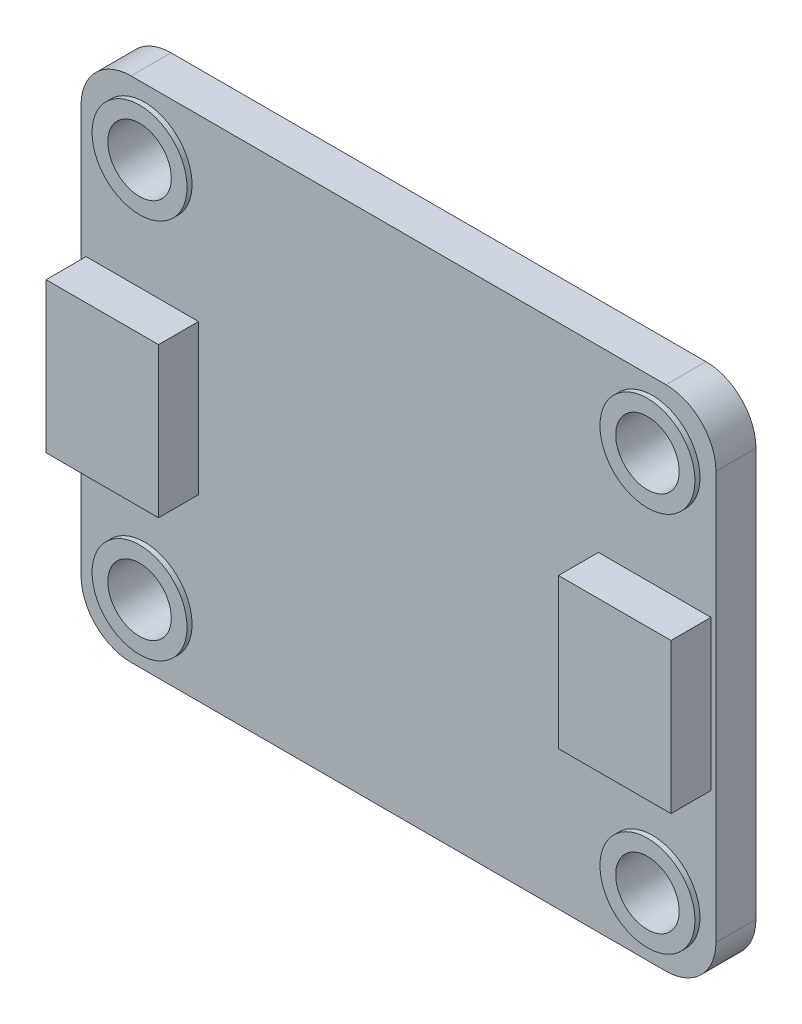
ISO-10303-21;
HEADER;
FILE_DESCRIPTION(('STEP AP214'),'2;1');
FILE_NAME('part.step','',(''),(''),'','','');
FILE_SCHEMA(('AUTOMOTIVE_DESIGN { 1 0 10303 214 1 1 1 1 }'));
ENDSEC;
DATA;
#1=APPLICATION_CONTEXT('core data for automotive mechanical design processes');
#2=APPLICATION_PROTOCOL_DEFINITION('international standard','automotive_design',2000,#1);
#3=PRODUCT_CONTEXT('',#1,'mechanical');
#4=PRODUCT('Part','Part','',(#3));
#5=PRODUCT_RELATED_PRODUCT_CATEGORY('part','',(#4));
#6=PRODUCT_DEFINITION_FORMATION('','',#4);
#7=PRODUCT_DEFINITION_CONTEXT('part definition',#1,'design');
#8=PRODUCT_DEFINITION('design','',#6,#7);
#9=PRODUCT_DEFINITION_SHAPE('','',#8);
#10=(LENGTH_UNIT() NAMED_UNIT(*) SI_UNIT(.MILLI.,.METRE.));
#11=(NAMED_UNIT(*) PLANE_ANGLE_UNIT() SI_UNIT($,.RADIAN.));
#12=(NAMED_UNIT(*) SI_UNIT($,.STERADIAN.) SOLID_ANGLE_UNIT());
#13=UNCERTAINTY_MEASURE_WITH_UNIT(LENGTH_MEASURE(1.E-05),#10,'distance_accuracy_value','');
#14=(GEOMETRIC_REPRESENTATION_CONTEXT(3) GLOBAL_UNCERTAINTY_ASSIGNED_CONTEXT((#13)) GLOBAL_UNIT_ASSIGNED_CONTEXT((#10,
#11,#12)) REPRESENTATION_CONTEXT('',''));
#15=CARTESIAN_POINT('',(0.,0.,0.));
#16=DIRECTION('',(0.,0.,1.));
#17=DIRECTION('',(1.,0.,0.));
#18=AXIS2_PLACEMENT_3D('',#15,#16,#17);
#19=CARTESIAN_POINT('',(0.,0.,1.6));
#20=DIRECTION('',(0.,0.,-1.));
#21=DIRECTION('',(-1.,0.,0.));
#22=AXIS2_PLACEMENT_3D('',#19,#20,#21);
#23=PLANE('',#22);
#24=DIRECTION('',(0.,-1.,0.));
#25=VECTOR('',#24,1.);
#26=CARTESIAN_POINT('',(0.200000000000002,0.,1.6));
#27=LINE('',#26,#25);
#28=CARTESIAN_POINT('',(0.2,13.16,1.6));
#29=VERTEX_POINT('',#28);
#30=CARTESIAN_POINT('',(0.200000000000001,7.16,1.6));
#31=VERTEX_POINT('',#30);
#32=EDGE_CURVE('E162',#29,#31,#27,.T.);
#33=ORIENTED_EDGE('',*,*,#32,.F.);
#34=DIRECTION('',(-1.,0.,0.));
#35=VECTOR('',#34,1.);
#36=CARTESIAN_POINT('',(0.,13.16,1.6));
#37=LINE('',#36,#35);
#38=CARTESIAN_POINT('',(4.7,13.16,1.6));
#39=VERTEX_POINT('',#38);
#40=EDGE_CURVE('E205',#39,#29,#37,.T.);
#41=ORIENTED_EDGE('',*,*,#40,.F.);
#42=DIRECTION('',(0.,1.,0.));
#43=VECTOR('',#42,1.);
#44=CARTESIAN_POINT('',(4.7,0.,1.6));
#45=LINE('',#44,#43);
#46=CARTESIAN_POINT('',(4.7,7.16,1.6));
#47=VERTEX_POINT('',#46);
#48=EDGE_CURVE('E222',#47,#39,#45,.T.);
#49=ORIENTED_EDGE('',*,*,#48,.F.);
#50=DIRECTION('',(1.,0.,0.));
#51=VECTOR('',#50,1.);
#52=CARTESIAN_POINT('',(0.,7.16,1.6));
#53=LINE('',#52,#51);
#54=EDGE_CURVE('E218',#31,#47,#53,.T.);
#55=ORIENTED_EDGE('',*,*,#54,.F.);
#56=EDGE_LOOP('',(#33,#41,#49,#55));
#57=FACE_BOUND('',#56,.T.);
#58=CARTESIAN_POINT('',(22.86,2.54,1.6));
#59=DIRECTION('',(0.,0.,-1.));
#60=DIRECTION('',(-1.,0.,0.));
#61=AXIS2_PLACEMENT_3D('',#58,#59,#60);
#62=CIRCLE('',#61,1.9);
#63=CARTESIAN_POINT('',(20.96,2.54,1.6));
#64=VERTEX_POINT('',#63);
#65=EDGE_CURVE('E53',#64,#64,#62,.F.);
#66=ORIENTED_EDGE('',*,*,#65,.F.);
#67=EDGE_LOOP('',(#66));
#68=FACE_BOUND('',#67,.T.);
#69=CARTESIAN_POINT('',(2.54,17.78,1.6));
#70=DIRECTION('',(0.,0.,-1.));
#71=DIRECTION('',(-1.,0.,0.));
#72=AXIS2_PLACEMENT_3D('',#69,#70,#71);
#73=CIRCLE('',#72,1.9);
#74=CARTESIAN_POINT('',(0.639999999999999,17.78,1.6));
#75=VERTEX_POINT('',#74);
#76=EDGE_CURVE('E301',#75,#75,#73,.F.);
#77=ORIENTED_EDGE('',*,*,#76,.F.);
#78=EDGE_LOOP('',(#77));
#79=FACE_BOUND('',#78,.T.);
#80=DIRECTION('',(-1.,0.,0.));
#81=VECTOR('',#80,1.);
#82=CARTESIAN_POINT('',(0.,20.32,1.6));
#83=LINE('',#82,#81);
#84=CARTESIAN_POINT('',(23.4,20.32,1.6));
#85=VERTEX_POINT('',#84);
#86=CARTESIAN_POINT('',(1.99999999999999,20.32,1.6));
#87=VERTEX_POINT('',#86);
#88=EDGE_CURVE('E336',#85,#87,#83,.T.);
#89=ORIENTED_EDGE('',*,*,#88,.T.);
#90=CARTESIAN_POINT('',(1.99999999999999,18.32,1.6));
#91=DIRECTION('',(0.,0.,-1.));
#92=DIRECTION('',(-1.,0.,0.));
#93=AXIS2_PLACEMENT_3D('',#90,#91,#92);
#94=CIRCLE('',#93,2.);
#95=CARTESIAN_POINT('',(0.,18.32,1.6));
#96=VERTEX_POINT('',#95);
#97=EDGE_CURVE('E390',#87,#96,#94,.F.);
#98=ORIENTED_EDGE('',*,*,#97,.T.);
#99=DIRECTION('',(0.,-1.,0.));
#100=VECTOR('',#99,1.);
#101=CARTESIAN_POINT('',(0.,0.,1.6));
#102=LINE('',#101,#100);
#103=CARTESIAN_POINT('',(0.,2.,1.6));
#104=VERTEX_POINT('',#103);
#105=EDGE_CURVE('E323',#96,#104,#102,.T.);
#106=ORIENTED_EDGE('',*,*,#105,.T.);
#107=CARTESIAN_POINT('',(2.,2.,1.6));
#108=DIRECTION('',(0.,0.,-1.));
#109=DIRECTION('',(-1.,0.,0.));
#110=AXIS2_PLACEMENT_3D('',#107,#108,#109);
#111=CIRCLE('',#110,2.);
#112=CARTESIAN_POINT('',(2.,0.,1.6));
#113=VERTEX_POINT('',#112);
#114=EDGE_CURVE('E387',#104,#113,#111,.F.);
#115=ORIENTED_EDGE('',*,*,#114,.T.);
#116=DIRECTION('',(1.,0.,0.));
#117=VECTOR('',#116,1.);
#118=CARTESIAN_POINT('',(0.,0.,1.6));
#119=LINE('',#118,#117);
#120=CARTESIAN_POINT('',(23.4,0.,1.6));
#121=VERTEX_POINT('',#120);
#122=EDGE_CURVE('E327',#113,#121,#119,.T.);
#123=ORIENTED_EDGE('',*,*,#122,.T.);
#124=CARTESIAN_POINT('',(23.4,2.,1.6));
#125=DIRECTION('',(0.,0.,-1.));
#126=DIRECTION('',(-1.,0.,0.));
#127=AXIS2_PLACEMENT_3D('',#124,#125,#126);
#128=CIRCLE('',#127,2.);
#129=CARTESIAN_POINT('',(25.4,2.,1.6));
#130=VERTEX_POINT('',#129);
#131=EDGE_CURVE('E384',#121,#130,#128,.F.);
#132=ORIENTED_EDGE('',*,*,#131,.T.);
#133=DIRECTION('',(0.,1.,0.));
#134=VECTOR('',#133,1.);
#135=CARTESIAN_POINT('',(25.4,0.,1.6));
#136=LINE('',#135,#134);
#137=CARTESIAN_POINT('',(25.4,18.32,1.6));
#138=VERTEX_POINT('',#137);
#139=EDGE_CURVE('E332',#130,#138,#136,.T.);
#140=ORIENTED_EDGE('',*,*,#139,.T.);
#141=CARTESIAN_POINT('',(23.4,18.32,1.6));
#142=DIRECTION('',(0.,0.,-1.));
#143=DIRECTION('',(-1.,0.,0.));
#144=AXIS2_PLACEMENT_3D('',#141,#142,#143);
#145=CIRCLE('',#144,2.);
#146=EDGE_CURVE('E381',#138,#85,#145,.F.);
#147=ORIENTED_EDGE('',*,*,#146,.T.);
#148=EDGE_LOOP('',(#89,#98,#106,#115,#123,#132,#140,#147));
#149=FACE_BOUND('',#148,.T.);
#150=CARTESIAN_POINT('',(22.86,17.78,1.6));
#151=DIRECTION('',(0.,0.,-1.));
#152=DIRECTION('',(-1.,0.,0.));
#153=AXIS2_PLACEMENT_3D('',#150,#151,#152);
#154=CIRCLE('',#153,1.9);
#155=CARTESIAN_POINT('',(20.96,17.78,1.6));
#156=VERTEX_POINT('',#155);
#157=EDGE_CURVE('E280',#156,#156,#154,.F.);
#158=ORIENTED_EDGE('',*,*,#157,.F.);
#159=EDGE_LOOP('',(#158));
#160=FACE_BOUND('',#159,.T.);
#161=CARTESIAN_POINT('',(2.54,2.54,1.6));
#162=DIRECTION('',(0.,0.,-1.));
#163=DIRECTION('',(-1.,0.,0.));
#164=AXIS2_PLACEMENT_3D('',#161,#162,#163);
#165=CIRCLE('',#164,1.9);
#166=CARTESIAN_POINT('',(0.639999999999999,2.54,1.6));
#167=VERTEX_POINT('',#166);
#168=EDGE_CURVE('E11',#167,#167,#165,.F.);
#169=ORIENTED_EDGE('',*,*,#168,.F.);
#170=EDGE_LOOP('',(#169));
#171=FACE_BOUND('',#170,.T.);
#172=DIRECTION('',(0.,-1.,0.));
#173=VECTOR('',#172,1.);
#174=CARTESIAN_POINT('',(20.7,0.,1.6));
#175=LINE('',#174,#173);
#176=CARTESIAN_POINT('',(20.7,13.16,1.6));
#177=VERTEX_POINT('',#176);
#178=CARTESIAN_POINT('',(20.7,7.16,1.6));
#179=VERTEX_POINT('',#178);
#180=EDGE_CURVE('E155',#177,#179,#175,.T.);
#181=ORIENTED_EDGE('',*,*,#180,.F.);
#182=DIRECTION('',(-1.,0.,0.));
#183=VECTOR('',#182,1.);
#184=CARTESIAN_POINT('',(0.,13.16,1.6));
#185=LINE('',#184,#183);
#186=CARTESIAN_POINT('',(25.2,13.16,1.6));
#187=VERTEX_POINT('',#186);
#188=EDGE_CURVE('E157',#187,#177,#185,.T.);
#189=ORIENTED_EDGE('',*,*,#188,.F.);
#190=DIRECTION('',(0.,1.,0.));
#191=VECTOR('',#190,1.);
#192=CARTESIAN_POINT('',(25.2,0.,1.6));
#193=LINE('',#192,#191);
#194=CARTESIAN_POINT('',(25.2,7.16,1.6));
#195=VERTEX_POINT('',#194);
#196=EDGE_CURVE('E66',#195,#187,#193,.T.);
#197=ORIENTED_EDGE('',*,*,#196,.F.);
#198=DIRECTION('',(1.,0.,0.));
#199=VECTOR('',#198,1.);
#200=CARTESIAN_POINT('',(0.,7.16,1.6));
#201=LINE('',#200,#199);
#202=EDGE_CURVE('E61',#179,#195,#201,.T.);
#203=ORIENTED_EDGE('',*,*,#202,.F.);
#204=EDGE_LOOP('',(#181,#189,#197,#203));
#205=FACE_BOUND('',#204,.T.);
#206=ADVANCED_FACE('F43',(#57,#68,#79,#149,#160,#171,#205),#23,.F.);
#207=CARTESIAN_POINT('',(0.,0.,0.));
#208=DIRECTION('',(0.,0.,-1.));
#209=DIRECTION('',(-1.,0.,0.));
#210=AXIS2_PLACEMENT_3D('',#207,#208,#209);
#211=PLANE('',#210);
#212=CARTESIAN_POINT('',(22.86,2.54,0.));
#213=DIRECTION('',(0.,0.,-1.));
#214=DIRECTION('',(-1.,0.,0.));
#215=AXIS2_PLACEMENT_3D('',#212,#213,#214);
#216=CIRCLE('',#215,1.9);
#217=CARTESIAN_POINT('',(20.96,2.54,0.));
#218=VERTEX_POINT('',#217);
#219=EDGE_CURVE('E273',#218,#218,#216,.F.);
#220=ORIENTED_EDGE('',*,*,#219,.T.);
#221=EDGE_LOOP('',(#220));
#222=FACE_BOUND('',#221,.T.);
#223=CARTESIAN_POINT('',(2.54,17.78,0.));
#224=DIRECTION('',(0.,0.,-1.));
#225=DIRECTION('',(-1.,0.,0.));
#226=AXIS2_PLACEMENT_3D('',#223,#224,#225);
#227=CIRCLE('',#226,1.9);
#228=CARTESIAN_POINT('',(0.639999999999999,17.78,0.));
#229=VERTEX_POINT('',#228);
#230=EDGE_CURVE('E315',#229,#229,#227,.F.);
#231=ORIENTED_EDGE('',*,*,#230,.T.);
#232=EDGE_LOOP('',(#231));
#233=FACE_BOUND('',#232,.T.);
#234=DIRECTION('',(0.,-1.,0.));
#235=VECTOR('',#234,1.);
#236=CARTESIAN_POINT('',(0.,0.,0.));
#237=LINE('',#236,#235);
#238=CARTESIAN_POINT('',(0.,18.32,0.));
#239=VERTEX_POINT('',#238);
#240=CARTESIAN_POINT('',(0.,2.,0.));
#241=VERTEX_POINT('',#240);
#242=EDGE_CURVE('E341',#239,#241,#237,.T.);
#243=ORIENTED_EDGE('',*,*,#242,.F.);
#244=CARTESIAN_POINT('',(1.99999999999999,18.32,0.));
#245=DIRECTION('',(0.,0.,-1.));
#246=DIRECTION('',(-1.,0.,0.));
#247=AXIS2_PLACEMENT_3D('',#244,#245,#246);
#248=CIRCLE('',#247,2.);
#249=CARTESIAN_POINT('',(1.99999999999999,20.32,0.));
#250=VERTEX_POINT('',#249);
#251=EDGE_CURVE('E371',#239,#250,#248,.T.);
#252=ORIENTED_EDGE('',*,*,#251,.T.);
#253=DIRECTION('',(-1.,0.,0.));
#254=VECTOR('',#253,1.);
#255=CARTESIAN_POINT('',(0.,20.32,0.));
#256=LINE('',#255,#254);
#257=CARTESIAN_POINT('',(23.4,20.32,0.));
#258=VERTEX_POINT('',#257);
#259=EDGE_CURVE('E328',#258,#250,#256,.T.);
#260=ORIENTED_EDGE('',*,*,#259,.F.);
#261=CARTESIAN_POINT('',(23.4,18.32,0.));
#262=DIRECTION('',(0.,0.,-1.));
#263=DIRECTION('',(-1.,0.,0.));
#264=AXIS2_PLACEMENT_3D('',#261,#262,#263);
#265=CIRCLE('',#264,2.);
#266=CARTESIAN_POINT('',(25.4,18.32,0.));
#267=VERTEX_POINT('',#266);
#268=EDGE_CURVE('E362',#258,#267,#265,.T.);
#269=ORIENTED_EDGE('',*,*,#268,.T.);
#270=DIRECTION('',(0.,1.,0.));
#271=VECTOR('',#270,1.);
#272=CARTESIAN_POINT('',(25.4,0.,0.));
#273=LINE('',#272,#271);
#274=CARTESIAN_POINT('',(25.4,2.,0.));
#275=VERTEX_POINT('',#274);
#276=EDGE_CURVE('E349',#275,#267,#273,.T.);
#277=ORIENTED_EDGE('',*,*,#276,.F.);
#278=CARTESIAN_POINT('',(23.4,2.,0.));
#279=DIRECTION('',(0.,0.,-1.));
#280=DIRECTION('',(-1.,0.,0.));
#281=AXIS2_PLACEMENT_3D('',#278,#279,#280);
#282=CIRCLE('',#281,2.);
#283=CARTESIAN_POINT('',(23.4,0.,0.));
#284=VERTEX_POINT('',#283);
#285=EDGE_CURVE('E365',#275,#284,#282,.T.);
#286=ORIENTED_EDGE('',*,*,#285,.T.);
#287=DIRECTION('',(1.,0.,0.));
#288=VECTOR('',#287,1.);
#289=CARTESIAN_POINT('',(0.,0.,0.));
#290=LINE('',#289,#288);
#291=CARTESIAN_POINT('',(2.,0.,0.));
#292=VERTEX_POINT('',#291);
#293=EDGE_CURVE('E345',#292,#284,#290,.T.);
#294=ORIENTED_EDGE('',*,*,#293,.F.);
#295=CARTESIAN_POINT('',(2.,2.,0.));
#296=DIRECTION('',(0.,0.,-1.));
#297=DIRECTION('',(-1.,0.,0.));
#298=AXIS2_PLACEMENT_3D('',#295,#296,#297);
#299=CIRCLE('',#298,2.);
#300=EDGE_CURVE('E368',#292,#241,#299,.T.);
#301=ORIENTED_EDGE('',*,*,#300,.T.);
#302=EDGE_LOOP('',(#243,#252,#260,#269,#277,#286,#294,#301));
#303=FACE_BOUND('',#302,.T.);
#304=CARTESIAN_POINT('',(22.86,17.78,0.));
#305=DIRECTION('',(0.,0.,-1.));
#306=DIRECTION('',(-1.,0.,0.));
#307=AXIS2_PLACEMENT_3D('',#304,#305,#306);
#308=CIRCLE('',#307,1.9);
#309=CARTESIAN_POINT('',(20.96,17.78,0.));
#310=VERTEX_POINT('',#309);
#311=EDGE_CURVE('E294',#310,#310,#308,.F.);
#312=ORIENTED_EDGE('',*,*,#311,.T.);
#313=EDGE_LOOP('',(#312));
#314=FACE_BOUND('',#313,.T.);
#315=CARTESIAN_POINT('',(2.54,2.54,0.));
#316=DIRECTION('',(0.,0.,-1.));
#317=DIRECTION('',(-1.,0.,0.));
#318=AXIS2_PLACEMENT_3D('',#315,#316,#317);
#319=CIRCLE('',#318,1.9);
#320=CARTESIAN_POINT('',(0.639999999999999,2.54,0.));
#321=VERTEX_POINT('',#320);
#322=EDGE_CURVE('E47',#321,#321,#319,.F.);
#323=ORIENTED_EDGE('',*,*,#322,.T.);
#324=EDGE_LOOP('',(#323));
#325=FACE_BOUND('',#324,.T.);
#326=ADVANCED_FACE('F415',(#222,#233,#303,#314,#325),#211,.T.);
#327=CARTESIAN_POINT('',(0.,0.,1.6));
#328=DIRECTION('',(1.,0.,0.));
#329=DIRECTION('',(0.,1.,0.));
#330=AXIS2_PLACEMENT_3D('',#327,#328,#329);
#331=PLANE('',#330);
#332=ORIENTED_EDGE('',*,*,#105,.F.);
#333=DIRECTION('',(0.,0.,-1.));
#334=VECTOR('',#333,1.);
#335=CARTESIAN_POINT('',(0.,18.32,1.6));
#336=LINE('',#335,#334);
#337=EDGE_CURVE('E358',#96,#239,#336,.T.);
#338=ORIENTED_EDGE('',*,*,#337,.T.);
#339=ORIENTED_EDGE('',*,*,#242,.T.);
#340=DIRECTION('',(0.,0.,-1.));
#341=VECTOR('',#340,1.);
#342=CARTESIAN_POINT('',(0.,2.,1.6));
#343=LINE('',#342,#341);
#344=EDGE_CURVE('E340',#241,#104,#343,.F.);
#345=ORIENTED_EDGE('',*,*,#344,.T.);
#346=EDGE_LOOP('',(#332,#338,#339,#345));
#347=FACE_BOUND('',#346,.T.);
#348=ADVANCED_FACE('F459',(#347),#331,.F.);
#349=CARTESIAN_POINT('',(0.,0.,1.6));
#350=DIRECTION('',(0.,1.,0.));
#351=DIRECTION('',(0.,0.,1.));
#352=AXIS2_PLACEMENT_3D('',#349,#350,#351);
#353=PLANE('',#352);
#354=ORIENTED_EDGE('',*,*,#122,.F.);
#355=DIRECTION('',(0.,0.,-1.));
#356=VECTOR('',#355,1.);
#357=CARTESIAN_POINT('',(2.,0.,1.6));
#358=LINE('',#357,#356);
#359=EDGE_CURVE('E396',#113,#292,#358,.T.);
#360=ORIENTED_EDGE('',*,*,#359,.T.);
#361=ORIENTED_EDGE('',*,*,#293,.T.);
#362=DIRECTION('',(0.,0.,-1.));
#363=VECTOR('',#362,1.);
#364=CARTESIAN_POINT('',(23.4,0.,1.6));
#365=LINE('',#364,#363);
#366=EDGE_CURVE('E393',#284,#121,#365,.F.);
#367=ORIENTED_EDGE('',*,*,#366,.T.);
#368=EDGE_LOOP('',(#354,#360,#361,#367));
#369=FACE_BOUND('',#368,.T.);
#370=ADVANCED_FACE('F474',(#369),#353,.F.);
#371=CARTESIAN_POINT('',(25.4,0.,1.6));
#372=DIRECTION('',(-1.,0.,0.));
#373=DIRECTION('',(0.,-1.,0.));
#374=AXIS2_PLACEMENT_3D('',#371,#372,#373);
#375=PLANE('',#374);
#376=ORIENTED_EDGE('',*,*,#139,.F.);
#377=DIRECTION('',(0.,0.,-1.));
#378=VECTOR('',#377,1.);
#379=CARTESIAN_POINT('',(25.4,2.,1.6));
#380=LINE('',#379,#378);
#381=EDGE_CURVE('E322',#130,#275,#380,.T.);
#382=ORIENTED_EDGE('',*,*,#381,.T.);
#383=ORIENTED_EDGE('',*,*,#276,.T.);
#384=DIRECTION('',(0.,0.,-1.));
#385=VECTOR('',#384,1.);
#386=CARTESIAN_POINT('',(25.4,18.32,1.6));
#387=LINE('',#386,#385);
#388=EDGE_CURVE('E400',#267,#138,#387,.F.);
#389=ORIENTED_EDGE('',*,*,#388,.T.);
#390=EDGE_LOOP('',(#376,#382,#383,#389));
#391=FACE_BOUND('',#390,.T.);
#392=ADVANCED_FACE('F470',(#391),#375,.F.);
#393=CARTESIAN_POINT('',(0.,20.32,1.6));
#394=DIRECTION('',(0.,-1.,0.));
#395=DIRECTION('',(0.,0.,-1.));
#396=AXIS2_PLACEMENT_3D('',#393,#394,#395);
#397=PLANE('',#396);
#398=ORIENTED_EDGE('',*,*,#259,.T.);
#399=DIRECTION('',(0.,0.,-1.));
#400=VECTOR('',#399,1.);
#401=CARTESIAN_POINT('',(1.99999999999999,20.32,1.6));
#402=LINE('',#401,#400);
#403=EDGE_CURVE('E378',#250,#87,#402,.F.);
#404=ORIENTED_EDGE('',*,*,#403,.T.);
#405=ORIENTED_EDGE('',*,*,#88,.F.);
#406=DIRECTION('',(0.,0.,-1.));
#407=VECTOR('',#406,1.);
#408=CARTESIAN_POINT('',(23.4,20.32,1.6));
#409=LINE('',#408,#407);
#410=EDGE_CURVE('E374',#85,#258,#409,.T.);
#411=ORIENTED_EDGE('',*,*,#410,.T.);
#412=EDGE_LOOP('',(#398,#404,#405,#411));
#413=FACE_BOUND('',#412,.T.);
#414=ADVANCED_FACE('F466',(#413),#397,.F.);
#415=CARTESIAN_POINT('',(1.99999999999999,18.32,1.6));
#416=DIRECTION('',(0.,0.,-1.));
#417=DIRECTION('',(-1.,0.,0.));
#418=AXIS2_PLACEMENT_3D('',#415,#416,#417);
#419=CYLINDRICAL_SURFACE('',#418,2.);
#420=ORIENTED_EDGE('',*,*,#97,.F.);
#421=ORIENTED_EDGE('',*,*,#403,.F.);
#422=ORIENTED_EDGE('',*,*,#251,.F.);
#423=ORIENTED_EDGE('',*,*,#337,.F.);
#424=EDGE_LOOP('',(#420,#421,#422,#423));
#425=FACE_BOUND('',#424,.T.);
#426=ADVANCED_FACE('F469',(#425),#419,.T.);
#427=CARTESIAN_POINT('',(2.,2.,1.6));
#428=DIRECTION('',(0.,0.,-1.));
#429=DIRECTION('',(-1.,0.,0.));
#430=AXIS2_PLACEMENT_3D('',#427,#428,#429);
#431=CYLINDRICAL_SURFACE('',#430,2.);
#432=ORIENTED_EDGE('',*,*,#114,.F.);
#433=ORIENTED_EDGE('',*,*,#344,.F.);
#434=ORIENTED_EDGE('',*,*,#300,.F.);
#435=ORIENTED_EDGE('',*,*,#359,.F.);
#436=EDGE_LOOP('',(#432,#433,#434,#435));
#437=FACE_BOUND('',#436,.T.);
#438=ADVANCED_FACE('F484',(#437),#431,.T.);
#439=CARTESIAN_POINT('',(23.4,2.,1.6));
#440=DIRECTION('',(0.,0.,-1.));
#441=DIRECTION('',(-1.,0.,0.));
#442=AXIS2_PLACEMENT_3D('',#439,#440,#441);
#443=CYLINDRICAL_SURFACE('',#442,2.);
#444=ORIENTED_EDGE('',*,*,#131,.F.);
#445=ORIENTED_EDGE('',*,*,#366,.F.);
#446=ORIENTED_EDGE('',*,*,#285,.F.);
#447=ORIENTED_EDGE('',*,*,#381,.F.);
#448=EDGE_LOOP('',(#444,#445,#446,#447));
#449=FACE_BOUND('',#448,.T.);
#450=ADVANCED_FACE('F487',(#449),#443,.T.);
#451=CARTESIAN_POINT('',(23.4,18.32,1.6));
#452=DIRECTION('',(0.,0.,-1.));
#453=DIRECTION('',(-1.,0.,0.));
#454=AXIS2_PLACEMENT_3D('',#451,#452,#453);
#455=CYLINDRICAL_SURFACE('',#454,2.);
#456=ORIENTED_EDGE('',*,*,#146,.F.);
#457=ORIENTED_EDGE('',*,*,#388,.F.);
#458=ORIENTED_EDGE('',*,*,#268,.F.);
#459=ORIENTED_EDGE('',*,*,#410,.F.);
#460=EDGE_LOOP('',(#456,#457,#458,#459));
#461=FACE_BOUND('',#460,.T.);
#462=ADVANCED_FACE('F45',(#461),#455,.T.);
#463=CARTESIAN_POINT('',(2.54,17.78,1.8));
#464=DIRECTION('',(0.,0.,-1.));
#465=DIRECTION('',(-1.,0.,0.));
#466=AXIS2_PLACEMENT_3D('',#463,#464,#465);
#467=CYLINDRICAL_SURFACE('',#466,1.9);
#468=ORIENTED_EDGE('',*,*,#230,.F.);
#469=EDGE_LOOP('',(#468));
#470=FACE_BOUND('',#469,.T.);
#471=CARTESIAN_POINT('',(2.54,17.78,-0.2));
#472=DIRECTION('',(0.,0.,1.));
#473=DIRECTION('',(1.,0.,0.));
#474=AXIS2_PLACEMENT_3D('',#471,#472,#473);
#475=CIRCLE('',#474,1.9);
#476=CARTESIAN_POINT('',(4.44,17.78,-0.2));
#477=VERTEX_POINT('',#476);
#478=EDGE_CURVE('E306',#477,#477,#475,.T.);
#479=ORIENTED_EDGE('',*,*,#478,.T.);
#480=EDGE_LOOP('',(#479));
#481=FACE_BOUND('',#480,.T.);
#482=ADVANCED_FACE('F494',(#470,#481),#467,.T.);
#483=CARTESIAN_POINT('',(2.54,17.78,-0.2));
#484=DIRECTION('',(0.,0.,1.));
#485=DIRECTION('',(1.,0.,0.));
#486=AXIS2_PLACEMENT_3D('',#483,#484,#485);
#487=PLANE('',#486);
#488=ORIENTED_EDGE('',*,*,#478,.F.);
#489=EDGE_LOOP('',(#488));
#490=FACE_BOUND('',#489,.T.);
#491=CARTESIAN_POINT('',(2.54,17.78,-0.2));
#492=DIRECTION('',(0.,0.,1.));
#493=DIRECTION('',(1.,0.,0.));
#494=AXIS2_PLACEMENT_3D('',#491,#492,#493);
#495=CIRCLE('',#494,1.27);
#496=CARTESIAN_POINT('',(3.81,17.78,-0.2));
#497=VERTEX_POINT('',#496);
#498=EDGE_CURVE('E307',#497,#497,#495,.T.);
#499=ORIENTED_EDGE('',*,*,#498,.T.);
#500=EDGE_LOOP('',(#499));
#501=FACE_BOUND('',#500,.T.);
#502=ADVANCED_FACE('F821',(#490,#501),#487,.F.);
#503=CARTESIAN_POINT('',(2.54,17.78,1.6));
#504=DIRECTION('',(0.,0.,-1.));
#505=DIRECTION('',(-1.,0.,0.));
#506=AXIS2_PLACEMENT_3D('',#503,#504,#505);
#507=CYLINDRICAL_SURFACE('',#506,1.27);
#508=ORIENTED_EDGE('',*,*,#498,.F.);
#509=EDGE_LOOP('',(#508));
#510=FACE_BOUND('',#509,.T.);
#511=CARTESIAN_POINT('',(2.54,17.78,1.8));
#512=DIRECTION('',(0.,0.,1.));
#513=DIRECTION('',(1.,0.,0.));
#514=AXIS2_PLACEMENT_3D('',#511,#512,#513);
#515=CIRCLE('',#514,1.27);
#516=CARTESIAN_POINT('',(3.81,17.78,1.8));
#517=VERTEX_POINT('',#516);
#518=EDGE_CURVE('E302',#517,#517,#515,.T.);
#519=ORIENTED_EDGE('',*,*,#518,.T.);
#520=EDGE_LOOP('',(#519));
#521=FACE_BOUND('',#520,.T.);
#522=ADVANCED_FACE('F463',(#510,#521),#507,.F.);
#523=CARTESIAN_POINT('',(2.54,17.78,1.8));
#524=DIRECTION('',(0.,0.,1.));
#525=DIRECTION('',(1.,0.,0.));
#526=AXIS2_PLACEMENT_3D('',#523,#524,#525);
#527=CIRCLE('',#526,1.9);
#528=CARTESIAN_POINT('',(4.44,17.78,1.8));
#529=VERTEX_POINT('',#528);
#530=EDGE_CURVE('E311',#529,#529,#527,.T.);
#531=ORIENTED_EDGE('',*,*,#530,.F.);
#532=EDGE_LOOP('',(#531));
#533=FACE_BOUND('',#532,.T.);
#534=ORIENTED_EDGE('',*,*,#76,.T.);
#535=EDGE_LOOP('',(#534));
#536=FACE_BOUND('',#535,.T.);
#537=ADVANCED_FACE('F800',(#533,#536),#467,.T.);
#538=CARTESIAN_POINT('',(2.54,17.78,1.8));
#539=DIRECTION('',(0.,0.,1.));
#540=DIRECTION('',(1.,0.,0.));
#541=AXIS2_PLACEMENT_3D('',#538,#539,#540);
#542=PLANE('',#541);
#543=ORIENTED_EDGE('',*,*,#530,.T.);
#544=EDGE_LOOP('',(#543));
#545=FACE_BOUND('',#544,.T.);
#546=ORIENTED_EDGE('',*,*,#518,.F.);
#547=EDGE_LOOP('',(#546));
#548=FACE_BOUND('',#547,.T.);
#549=ADVANCED_FACE('F790',(#545,#548),#542,.T.);
#550=CARTESIAN_POINT('',(22.86,17.78,1.8));
#551=DIRECTION('',(0.,0.,-1.));
#552=DIRECTION('',(-1.,0.,0.));
#553=AXIS2_PLACEMENT_3D('',#550,#551,#552);
#554=CYLINDRICAL_SURFACE('',#553,1.9);
#555=ORIENTED_EDGE('',*,*,#311,.F.);
#556=EDGE_LOOP('',(#555));
#557=FACE_BOUND('',#556,.T.);
#558=CARTESIAN_POINT('',(22.86,17.78,-0.2));
#559=DIRECTION('',(0.,0.,1.));
#560=DIRECTION('',(1.,0.,0.));
#561=AXIS2_PLACEMENT_3D('',#558,#559,#560);
#562=CIRCLE('',#561,1.9);
#563=CARTESIAN_POINT('',(24.76,17.78,-0.2));
#564=VERTEX_POINT('',#563);
#565=EDGE_CURVE('E281',#564,#564,#562,.T.);
#566=ORIENTED_EDGE('',*,*,#565,.T.);
#567=EDGE_LOOP('',(#566));
#568=FACE_BOUND('',#567,.T.);
#569=ADVANCED_FACE('F758',(#557,#568),#554,.T.);
#570=CARTESIAN_POINT('',(22.86,17.78,-0.2));
#571=DIRECTION('',(0.,0.,1.));
#572=DIRECTION('',(1.,0.,0.));
#573=AXIS2_PLACEMENT_3D('',#570,#571,#572);
#574=PLANE('',#573);
#575=ORIENTED_EDGE('',*,*,#565,.F.);
#576=EDGE_LOOP('',(#575));
#577=FACE_BOUND('',#576,.T.);
#578=CARTESIAN_POINT('',(22.86,17.78,-0.2));
#579=DIRECTION('',(0.,0.,1.));
#580=DIRECTION('',(1.,0.,0.));
#581=AXIS2_PLACEMENT_3D('',#578,#579,#580);
#582=CIRCLE('',#581,1.27);
#583=CARTESIAN_POINT('',(24.13,17.78,-0.2));
#584=VERTEX_POINT('',#583);
#585=EDGE_CURVE('E290',#584,#584,#582,.T.);
#586=ORIENTED_EDGE('',*,*,#585,.T.);
#587=EDGE_LOOP('',(#586));
#588=FACE_BOUND('',#587,.T.);
#589=ADVANCED_FACE('F767',(#577,#588),#574,.F.);
#590=CARTESIAN_POINT('',(22.86,17.78,1.6));
#591=DIRECTION('',(0.,0.,-1.));
#592=DIRECTION('',(-1.,0.,0.));
#593=AXIS2_PLACEMENT_3D('',#590,#591,#592);
#594=CYLINDRICAL_SURFACE('',#593,1.27);
#595=ORIENTED_EDGE('',*,*,#585,.F.);
#596=EDGE_LOOP('',(#595));
#597=FACE_BOUND('',#596,.T.);
#598=CARTESIAN_POINT('',(22.86,17.78,1.8));
#599=DIRECTION('',(0.,0.,1.));
#600=DIRECTION('',(1.,0.,0.));
#601=AXIS2_PLACEMENT_3D('',#598,#599,#600);
#602=CIRCLE('',#601,1.27);
#603=CARTESIAN_POINT('',(24.13,17.78,1.8));
#604=VERTEX_POINT('',#603);
#605=EDGE_CURVE('E285',#604,#604,#602,.T.);
#606=ORIENTED_EDGE('',*,*,#605,.T.);
#607=EDGE_LOOP('',(#606));
#608=FACE_BOUND('',#607,.T.);
#609=ADVANCED_FACE('F756',(#597,#608),#594,.F.);
#610=CARTESIAN_POINT('',(22.86,17.78,1.8));
#611=DIRECTION('',(0.,0.,1.));
#612=DIRECTION('',(1.,0.,0.));
#613=AXIS2_PLACEMENT_3D('',#610,#611,#612);
#614=CIRCLE('',#613,1.9);
#615=CARTESIAN_POINT('',(24.76,17.78,1.8));
#616=VERTEX_POINT('',#615);
#617=EDGE_CURVE('E286',#616,#616,#614,.T.);
#618=ORIENTED_EDGE('',*,*,#617,.F.);
#619=EDGE_LOOP('',(#618));
#620=FACE_BOUND('',#619,.T.);
#621=ORIENTED_EDGE('',*,*,#157,.T.);
#622=EDGE_LOOP('',(#621));
#623=FACE_BOUND('',#622,.T.);
#624=ADVANCED_FACE('F745',(#620,#623),#554,.T.);
#625=CARTESIAN_POINT('',(22.86,17.78,1.8));
#626=DIRECTION('',(0.,0.,1.));
#627=DIRECTION('',(1.,0.,0.));
#628=AXIS2_PLACEMENT_3D('',#625,#626,#627);
#629=PLANE('',#628);
#630=ORIENTED_EDGE('',*,*,#617,.T.);
#631=EDGE_LOOP('',(#630));
#632=FACE_BOUND('',#631,.T.);
#633=ORIENTED_EDGE('',*,*,#605,.F.);
#634=EDGE_LOOP('',(#633));
#635=FACE_BOUND('',#634,.T.);
#636=ADVANCED_FACE('F422',(#632,#635),#629,.T.);
#637=CARTESIAN_POINT('',(22.86,2.54,1.8));
#638=DIRECTION('',(0.,0.,-1.));
#639=DIRECTION('',(-1.,0.,0.));
#640=AXIS2_PLACEMENT_3D('',#637,#638,#639);
#641=CYLINDRICAL_SURFACE('',#640,1.9);
#642=ORIENTED_EDGE('',*,*,#219,.F.);
#643=EDGE_LOOP('',(#642));
#644=FACE_BOUND('',#643,.T.);
#645=CARTESIAN_POINT('',(22.86,2.54,-0.2));
#646=DIRECTION('',(0.,0.,1.));
#647=DIRECTION('',(1.,0.,0.));
#648=AXIS2_PLACEMENT_3D('',#645,#646,#647);
#649=CIRCLE('',#648,1.9);
#650=CARTESIAN_POINT('',(24.76,2.54,-0.2));
#651=VERTEX_POINT('',#650);
#652=EDGE_CURVE('E260',#651,#651,#649,.T.);
#653=ORIENTED_EDGE('',*,*,#652,.T.);
#654=EDGE_LOOP('',(#653));
#655=FACE_BOUND('',#654,.T.);
#656=ADVANCED_FACE('F418',(#644,#655),#641,.T.);
#657=CARTESIAN_POINT('',(22.86,2.54,-0.2));
#658=DIRECTION('',(0.,0.,1.));
#659=DIRECTION('',(1.,0.,0.));
#660=AXIS2_PLACEMENT_3D('',#657,#658,#659);
#661=PLANE('',#660);
#662=ORIENTED_EDGE('',*,*,#652,.F.);
#663=EDGE_LOOP('',(#662));
#664=FACE_BOUND('',#663,.T.);
#665=CARTESIAN_POINT('',(22.86,2.54,-0.2));
#666=DIRECTION('',(0.,0.,1.));
#667=DIRECTION('',(1.,0.,0.));
#668=AXIS2_PLACEMENT_3D('',#665,#666,#667);
#669=CIRCLE('',#668,1.27);
#670=CARTESIAN_POINT('',(24.13,2.54,-0.2));
#671=VERTEX_POINT('',#670);
#672=EDGE_CURVE('E269',#671,#671,#669,.T.);
#673=ORIENTED_EDGE('',*,*,#672,.T.);
#674=EDGE_LOOP('',(#673));
#675=FACE_BOUND('',#674,.T.);
#676=ADVANCED_FACE('F421',(#664,#675),#661,.F.);
#677=CARTESIAN_POINT('',(22.86,2.54,1.6));
#678=DIRECTION('',(0.,0.,-1.));
#679=DIRECTION('',(-1.,0.,0.));
#680=AXIS2_PLACEMENT_3D('',#677,#678,#679);
#681=CYLINDRICAL_SURFACE('',#680,1.27);
#682=ORIENTED_EDGE('',*,*,#672,.F.);
#683=EDGE_LOOP('',(#682));
#684=FACE_BOUND('',#683,.T.);
#685=CARTESIAN_POINT('',(22.86,2.54,1.8));
#686=DIRECTION('',(0.,0.,1.));
#687=DIRECTION('',(1.,0.,0.));
#688=AXIS2_PLACEMENT_3D('',#685,#686,#687);
#689=CIRCLE('',#688,1.27);
#690=CARTESIAN_POINT('',(24.13,2.54,1.8));
#691=VERTEX_POINT('',#690);
#692=EDGE_CURVE('E264',#691,#691,#689,.T.);
#693=ORIENTED_EDGE('',*,*,#692,.T.);
#694=EDGE_LOOP('',(#693));
#695=FACE_BOUND('',#694,.T.);
#696=ADVANCED_FACE('F429',(#684,#695),#681,.F.);
#697=CARTESIAN_POINT('',(22.86,2.54,1.8));
#698=DIRECTION('',(0.,0.,1.));
#699=DIRECTION('',(1.,0.,0.));
#700=AXIS2_PLACEMENT_3D('',#697,#698,#699);
#701=CIRCLE('',#700,1.9);
#702=CARTESIAN_POINT('',(24.76,2.54,1.8));
#703=VERTEX_POINT('',#702);
#704=EDGE_CURVE('E265',#703,#703,#701,.T.);
#705=ORIENTED_EDGE('',*,*,#704,.F.);
#706=EDGE_LOOP('',(#705));
#707=FACE_BOUND('',#706,.T.);
#708=ORIENTED_EDGE('',*,*,#65,.T.);
#709=EDGE_LOOP('',(#708));
#710=FACE_BOUND('',#709,.T.);
#711=ADVANCED_FACE('F424',(#707,#710),#641,.T.);
#712=CARTESIAN_POINT('',(22.86,2.54,1.8));
#713=DIRECTION('',(0.,0.,1.));
#714=DIRECTION('',(1.,0.,0.));
#715=AXIS2_PLACEMENT_3D('',#712,#713,#714);
#716=PLANE('',#715);
#717=ORIENTED_EDGE('',*,*,#704,.T.);
#718=EDGE_LOOP('',(#717));
#719=FACE_BOUND('',#718,.T.);
#720=ORIENTED_EDGE('',*,*,#692,.F.);
#721=EDGE_LOOP('',(#720));
#722=FACE_BOUND('',#721,.T.);
#723=ADVANCED_FACE('F438',(#719,#722),#716,.T.);
#724=CARTESIAN_POINT('',(2.54,2.54,1.8));
#725=DIRECTION('',(0.,0.,-1.));
#726=DIRECTION('',(-1.,0.,0.));
#727=AXIS2_PLACEMENT_3D('',#724,#725,#726);
#728=CYLINDRICAL_SURFACE('',#727,1.9);
#729=ORIENTED_EDGE('',*,*,#322,.F.);
#730=EDGE_LOOP('',(#729));
#731=FACE_BOUND('',#730,.T.);
#732=CARTESIAN_POINT('',(2.54,2.54,-0.2));
#733=DIRECTION('',(0.,0.,1.));
#734=DIRECTION('',(1.,0.,0.));
#735=AXIS2_PLACEMENT_3D('',#732,#733,#734);
#736=CIRCLE('',#735,1.9);
#737=CARTESIAN_POINT('',(4.44,2.54,-0.2));
#738=VERTEX_POINT('',#737);
#739=EDGE_CURVE('E245',#738,#738,#736,.T.);
#740=ORIENTED_EDGE('',*,*,#739,.T.);
#741=EDGE_LOOP('',(#740));
#742=FACE_BOUND('',#741,.T.);
#743=ADVANCED_FACE('F440',(#731,#742),#728,.T.);
#744=CARTESIAN_POINT('',(2.54,2.54,-0.2));
#745=DIRECTION('',(0.,0.,1.));
#746=DIRECTION('',(1.,0.,0.));
#747=AXIS2_PLACEMENT_3D('',#744,#745,#746);
#748=PLANE('',#747);
#749=ORIENTED_EDGE('',*,*,#739,.F.);
#750=EDGE_LOOP('',(#749));
#751=FACE_BOUND('',#750,.T.);
#752=CARTESIAN_POINT('',(2.54,2.54,-0.2));
#753=DIRECTION('',(0.,0.,1.));
#754=DIRECTION('',(1.,0.,0.));
#755=AXIS2_PLACEMENT_3D('',#752,#753,#754);
#756=CIRCLE('',#755,1.27);
#757=CARTESIAN_POINT('',(3.81,2.54,-0.2));
#758=VERTEX_POINT('',#757);
#759=EDGE_CURVE('E253',#758,#758,#756,.T.);
#760=ORIENTED_EDGE('',*,*,#759,.T.);
#761=EDGE_LOOP('',(#760));
#762=FACE_BOUND('',#761,.T.);
#763=ADVANCED_FACE('F447',(#751,#762),#748,.F.);
#764=CARTESIAN_POINT('',(2.54,2.54,1.6));
#765=DIRECTION('',(0.,0.,-1.));
#766=DIRECTION('',(-1.,0.,0.));
#767=AXIS2_PLACEMENT_3D('',#764,#765,#766);
#768=CYLINDRICAL_SURFACE('',#767,1.27);
#769=ORIENTED_EDGE('',*,*,#759,.F.);
#770=EDGE_LOOP('',(#769));
#771=FACE_BOUND('',#770,.T.);
#772=CARTESIAN_POINT('',(2.54,2.54,1.8));
#773=DIRECTION('',(0.,0.,1.));
#774=DIRECTION('',(1.,0.,0.));
#775=AXIS2_PLACEMENT_3D('',#772,#773,#774);
#776=CIRCLE('',#775,1.27);
#777=CARTESIAN_POINT('',(3.81,2.54,1.8));
#778=VERTEX_POINT('',#777);
#779=EDGE_CURVE('E249',#778,#778,#776,.T.);
#780=ORIENTED_EDGE('',*,*,#779,.T.);
#781=EDGE_LOOP('',(#780));
#782=FACE_BOUND('',#781,.T.);
#783=ADVANCED_FACE('F530',(#771,#782),#768,.F.);
#784=CARTESIAN_POINT('',(2.54,2.54,1.8));
#785=DIRECTION('',(0.,0.,1.));
#786=DIRECTION('',(1.,0.,0.));
#787=AXIS2_PLACEMENT_3D('',#784,#785,#786);
#788=CIRCLE('',#787,1.9);
#789=CARTESIAN_POINT('',(4.44,2.54,1.8));
#790=VERTEX_POINT('',#789);
#791=EDGE_CURVE('E244',#790,#790,#788,.T.);
#792=ORIENTED_EDGE('',*,*,#791,.F.);
#793=EDGE_LOOP('',(#792));
#794=FACE_BOUND('',#793,.T.);
#795=ORIENTED_EDGE('',*,*,#168,.T.);
#796=EDGE_LOOP('',(#795));
#797=FACE_BOUND('',#796,.T.);
#798=ADVANCED_FACE('F450',(#794,#797),#728,.T.);
#799=CARTESIAN_POINT('',(2.54,2.54,1.8));
#800=DIRECTION('',(0.,0.,1.));
#801=DIRECTION('',(1.,0.,0.));
#802=AXIS2_PLACEMENT_3D('',#799,#800,#801);
#803=PLANE('',#802);
#804=ORIENTED_EDGE('',*,*,#791,.T.);
#805=EDGE_LOOP('',(#804));
#806=FACE_BOUND('',#805,.T.);
#807=ORIENTED_EDGE('',*,*,#779,.F.);
#808=EDGE_LOOP('',(#807));
#809=FACE_BOUND('',#808,.T.);
#810=ADVANCED_FACE('F538',(#806,#809),#803,.T.);
#811=CARTESIAN_POINT('',(0.200000000000002,0.,3.2));
#812=DIRECTION('',(1.,0.,0.));
#813=DIRECTION('',(0.,1.,0.));
#814=AXIS2_PLACEMENT_3D('',#811,#812,#813);
#815=PLANE('',#814);
#816=ORIENTED_EDGE('',*,*,#32,.T.);
#817=DIRECTION('',(0.,0.,-1.));
#818=VECTOR('',#817,1.);
#819=CARTESIAN_POINT('',(0.200000000000001,7.16,3.2));
#820=LINE('',#819,#818);
#821=CARTESIAN_POINT('',(0.200000000000001,7.16,3.2));
#822=VERTEX_POINT('',#821);
#823=EDGE_CURVE('E240',#822,#31,#820,.T.);
#824=ORIENTED_EDGE('',*,*,#823,.F.);
#825=DIRECTION('',(0.,-1.,0.));
#826=VECTOR('',#825,1.);
#827=CARTESIAN_POINT('',(0.200000000000002,0.,3.2));
#828=LINE('',#827,#826);
#829=CARTESIAN_POINT('',(0.2,13.16,3.2));
#830=VERTEX_POINT('',#829);
#831=EDGE_CURVE('E200',#830,#822,#828,.T.);
#832=ORIENTED_EDGE('',*,*,#831,.F.);
#833=DIRECTION('',(0.,0.,-1.));
#834=VECTOR('',#833,1.);
#835=CARTESIAN_POINT('',(0.2,13.16,3.2));
#836=LINE('',#835,#834);
#837=EDGE_CURVE('E214',#830,#29,#836,.T.);
#838=ORIENTED_EDGE('',*,*,#837,.T.);
#839=EDGE_LOOP('',(#816,#824,#832,#838));
#840=FACE_BOUND('',#839,.T.);
#841=ADVANCED_FACE('F540',(#840),#815,.F.);
#842=CARTESIAN_POINT('',(0.,7.16,3.2));
#843=DIRECTION('',(0.,1.,0.));
#844=DIRECTION('',(0.,0.,1.));
#845=AXIS2_PLACEMENT_3D('',#842,#843,#844);
#846=PLANE('',#845);
#847=ORIENTED_EDGE('',*,*,#54,.T.);
#848=DIRECTION('',(0.,0.,-1.));
#849=VECTOR('',#848,1.);
#850=CARTESIAN_POINT('',(4.7,7.16,3.2));
#851=LINE('',#850,#849);
#852=CARTESIAN_POINT('',(4.7,7.16,3.2));
#853=VERTEX_POINT('',#852);
#854=EDGE_CURVE('E236',#853,#47,#851,.T.);
#855=ORIENTED_EDGE('',*,*,#854,.F.);
#856=DIRECTION('',(1.,0.,0.));
#857=VECTOR('',#856,1.);
#858=CARTESIAN_POINT('',(0.,7.16,3.2));
#859=LINE('',#858,#857);
#860=EDGE_CURVE('E204',#822,#853,#859,.T.);
#861=ORIENTED_EDGE('',*,*,#860,.F.);
#862=ORIENTED_EDGE('',*,*,#823,.T.);
#863=EDGE_LOOP('',(#847,#855,#861,#862));
#864=FACE_BOUND('',#863,.T.);
#865=ADVANCED_FACE('F547',(#864),#846,.F.);
#866=CARTESIAN_POINT('',(4.7,0.,3.2));
#867=DIRECTION('',(-1.,0.,0.));
#868=DIRECTION('',(0.,-1.,0.));
#869=AXIS2_PLACEMENT_3D('',#866,#867,#868);
#870=PLANE('',#869);
#871=ORIENTED_EDGE('',*,*,#48,.T.);
#872=DIRECTION('',(0.,0.,-1.));
#873=VECTOR('',#872,1.);
#874=CARTESIAN_POINT('',(4.7,13.16,3.2));
#875=LINE('',#874,#873);
#876=CARTESIAN_POINT('',(4.7,13.16,3.2));
#877=VERTEX_POINT('',#876);
#878=EDGE_CURVE('E232',#877,#39,#875,.T.);
#879=ORIENTED_EDGE('',*,*,#878,.F.);
#880=DIRECTION('',(0.,1.,0.));
#881=VECTOR('',#880,1.);
#882=CARTESIAN_POINT('',(4.7,0.,3.2));
#883=LINE('',#882,#881);
#884=EDGE_CURVE('E208',#853,#877,#883,.T.);
#885=ORIENTED_EDGE('',*,*,#884,.F.);
#886=ORIENTED_EDGE('',*,*,#854,.T.);
#887=EDGE_LOOP('',(#871,#879,#885,#886));
#888=FACE_BOUND('',#887,.T.);
#889=ADVANCED_FACE('F554',(#888),#870,.F.);
#890=CARTESIAN_POINT('',(0.,13.16,3.2));
#891=DIRECTION('',(0.,-1.,0.));
#892=DIRECTION('',(0.,0.,-1.));
#893=AXIS2_PLACEMENT_3D('',#890,#891,#892);
#894=PLANE('',#893);
#895=ORIENTED_EDGE('',*,*,#40,.T.);
#896=ORIENTED_EDGE('',*,*,#837,.F.);
#897=DIRECTION('',(-1.,0.,0.));
#898=VECTOR('',#897,1.);
#899=CARTESIAN_POINT('',(0.,13.16,3.2));
#900=LINE('',#899,#898);
#901=EDGE_CURVE('E211',#877,#830,#900,.T.);
#902=ORIENTED_EDGE('',*,*,#901,.F.);
#903=ORIENTED_EDGE('',*,*,#878,.T.);
#904=EDGE_LOOP('',(#895,#896,#902,#903));
#905=FACE_BOUND('',#904,.T.);
#906=ADVANCED_FACE('F558',(#905),#894,.F.);
#907=CARTESIAN_POINT('',(0.,0.,3.2));
#908=DIRECTION('',(0.,0.,1.));
#909=DIRECTION('',(1.,0.,0.));
#910=AXIS2_PLACEMENT_3D('',#907,#908,#909);
#911=PLANE('',#910);
#912=ORIENTED_EDGE('',*,*,#831,.T.);
#913=ORIENTED_EDGE('',*,*,#860,.T.);
#914=ORIENTED_EDGE('',*,*,#884,.T.);
#915=ORIENTED_EDGE('',*,*,#901,.T.);
#916=EDGE_LOOP('',(#912,#913,#914,#915));
#917=FACE_BOUND('',#916,.T.);
#918=ADVANCED_FACE('F562',(#917),#911,.T.);
#919=CARTESIAN_POINT('',(20.7,0.,3.2));
#920=DIRECTION('',(1.,0.,0.));
#921=DIRECTION('',(0.,1.,0.));
#922=AXIS2_PLACEMENT_3D('',#919,#920,#921);
#923=PLANE('',#922);
#924=ORIENTED_EDGE('',*,*,#180,.T.);
#925=DIRECTION('',(0.,0.,-1.));
#926=VECTOR('',#925,1.);
#927=CARTESIAN_POINT('',(20.7,7.16,3.2));
#928=LINE('',#927,#926);
#929=CARTESIAN_POINT('',(20.7,7.16,3.2));
#930=VERTEX_POINT('',#929);
#931=EDGE_CURVE('E967',#930,#179,#928,.T.);
#932=ORIENTED_EDGE('',*,*,#931,.F.);
#933=DIRECTION('',(0.,-1.,0.));
#934=VECTOR('',#933,1.);
#935=CARTESIAN_POINT('',(20.7,0.,3.2));
#936=LINE('',#935,#934);
#937=CARTESIAN_POINT('',(20.7,13.16,3.2));
#938=VERTEX_POINT('',#937);
#939=EDGE_CURVE('E174',#938,#930,#936,.T.);
#940=ORIENTED_EDGE('',*,*,#939,.F.);
#941=DIRECTION('',(0.,0.,-1.));
#942=VECTOR('',#941,1.);
#943=CARTESIAN_POINT('',(20.7,13.16,3.2));
#944=LINE('',#943,#942);
#945=EDGE_CURVE('E169',#938,#177,#944,.T.);
#946=ORIENTED_EDGE('',*,*,#945,.T.);
#947=EDGE_LOOP('',(#924,#932,#940,#946));
#948=FACE_BOUND('',#947,.T.);
#949=ADVANCED_FACE('F176',(#948),#923,.F.);
#950=CARTESIAN_POINT('',(0.,7.16,3.2));
#951=DIRECTION('',(0.,1.,0.));
#952=DIRECTION('',(0.,0.,1.));
#953=AXIS2_PLACEMENT_3D('',#950,#951,#952);
#954=PLANE('',#953);
#955=ORIENTED_EDGE('',*,*,#202,.T.);
#956=DIRECTION('',(0.,0.,-1.));
#957=VECTOR('',#956,1.);
#958=CARTESIAN_POINT('',(25.2,7.16,3.2));
#959=LINE('',#958,#957);
#960=CARTESIAN_POINT('',(25.2,7.16,3.2));
#961=VERTEX_POINT('',#960);
#962=EDGE_CURVE('E185',#961,#195,#959,.T.);
#963=ORIENTED_EDGE('',*,*,#962,.F.);
#964=DIRECTION('',(1.,0.,0.));
#965=VECTOR('',#964,1.);
#966=CARTESIAN_POINT('',(0.,7.16,3.2));
#967=LINE('',#966,#965);
#968=EDGE_CURVE('E195',#930,#961,#967,.T.);
#969=ORIENTED_EDGE('',*,*,#968,.F.);
#970=ORIENTED_EDGE('',*,*,#931,.T.);
#971=EDGE_LOOP('',(#955,#963,#969,#970));
#972=FACE_BOUND('',#971,.T.);
#973=ADVANCED_FACE('F576',(#972),#954,.F.);
#974=CARTESIAN_POINT('',(25.2,0.,3.2));
#975=DIRECTION('',(-1.,0.,0.));
#976=DIRECTION('',(0.,0.,1.));
#977=AXIS2_PLACEMENT_3D('',#974,#975,#976);
#978=PLANE('',#977);
#979=ORIENTED_EDGE('',*,*,#196,.T.);
#980=DIRECTION('',(0.,0.,-1.));
#981=VECTOR('',#980,1.);
#982=CARTESIAN_POINT('',(25.2,13.16,3.2));
#983=LINE('',#982,#981);
#984=CARTESIAN_POINT('',(25.2,13.16,3.2));
#985=VERTEX_POINT('',#984);
#986=EDGE_CURVE('E172',#985,#187,#983,.T.);
#987=ORIENTED_EDGE('',*,*,#986,.F.);
#988=DIRECTION('',(0.,1.,0.));
#989=VECTOR('',#988,1.);
#990=CARTESIAN_POINT('',(25.2,0.,3.2));
#991=LINE('',#990,#989);
#992=EDGE_CURVE('E183',#961,#985,#991,.T.);
#993=ORIENTED_EDGE('',*,*,#992,.F.);
#994=ORIENTED_EDGE('',*,*,#962,.T.);
#995=EDGE_LOOP('',(#979,#987,#993,#994));
#996=FACE_BOUND('',#995,.T.);
#997=ADVANCED_FACE('F573',(#996),#978,.F.);
#998=CARTESIAN_POINT('',(0.,13.16,3.2));
#999=DIRECTION('',(0.,-1.,0.));
#1000=DIRECTION('',(0.,0.,-1.));
#1001=AXIS2_PLACEMENT_3D('',#998,#999,#1000);
#1002=PLANE('',#1001);
#1003=ORIENTED_EDGE('',*,*,#188,.T.);
#1004=ORIENTED_EDGE('',*,*,#945,.F.);
#1005=DIRECTION('',(-1.,0.,0.));
#1006=VECTOR('',#1005,1.);
#1007=CARTESIAN_POINT('',(0.,13.16,3.2));
#1008=LINE('',#1007,#1006);
#1009=EDGE_CURVE('E179',#985,#938,#1008,.T.);
#1010=ORIENTED_EDGE('',*,*,#1009,.F.);
#1011=ORIENTED_EDGE('',*,*,#986,.T.);
#1012=EDGE_LOOP('',(#1003,#1004,#1010,#1011));
#1013=FACE_BOUND('',#1012,.T.);
#1014=ADVANCED_FACE('F167',(#1013),#1002,.F.);
#1015=CARTESIAN_POINT('',(0.,0.,3.2));
#1016=DIRECTION('',(0.,0.,1.));
#1017=DIRECTION('',(1.,0.,0.));
#1018=AXIS2_PLACEMENT_3D('',#1015,#1016,#1017);
#1019=PLANE('',#1018);
#1020=ORIENTED_EDGE('',*,*,#939,.T.);
#1021=ORIENTED_EDGE('',*,*,#968,.T.);
#1022=ORIENTED_EDGE('',*,*,#992,.T.);
#1023=ORIENTED_EDGE('',*,*,#1009,.T.);
#1024=EDGE_LOOP('',(#1020,#1021,#1022,#1023));
#1025=FACE_BOUND('',#1024,.T.);
#1026=ADVANCED_FACE('F567',(#1025),#1019,.T.);
#1027=CLOSED_SHELL('',(#206,#326,#348,#370,#392,#414,#426,#438,#450,#462,#482,#502,#522,#537,
#549,#569,#589,#609,#624,#636,#656,#676,#696,#711,#723,#743,#763,#783,#798,#810,#841,#865,#889,
#906,#918,#949,#973,#997,#1014,#1026));
#1028=MANIFOLD_SOLID_BREP('B2',#1027);
#1029=ADVANCED_BREP_SHAPE_REPRESENTATION('',(#18,#1028),#14);
#1030=SHAPE_DEFINITION_REPRESENTATION(#9,#1029);
ENDSEC;
END-ISO-10303-21;
